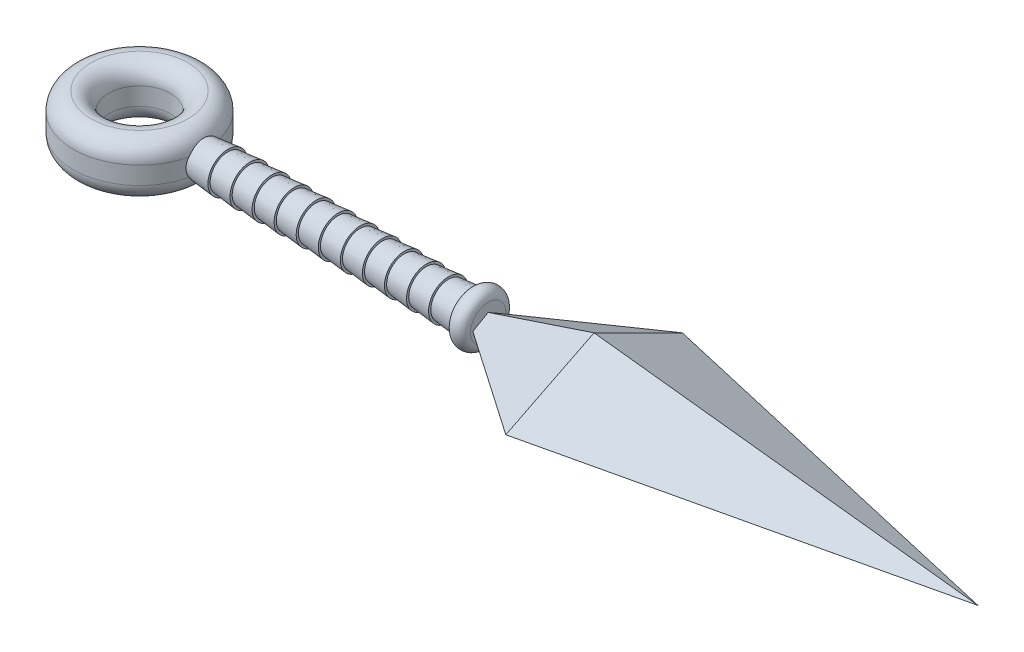
ISO-10303-21;
HEADER;
FILE_DESCRIPTION(('STEP AP214'),'2;1');
FILE_NAME('part.step','',(''),(''),'','','');
FILE_SCHEMA(('AUTOMOTIVE_DESIGN { 1 0 10303 214 1 1 1 1 }'));
ENDSEC;
DATA;
#1=APPLICATION_CONTEXT('core data for automotive mechanical design processes');
#2=APPLICATION_PROTOCOL_DEFINITION('international standard','automotive_design',2000,#1);
#3=PRODUCT_CONTEXT('',#1,'mechanical');
#4=PRODUCT('Part','Part','',(#3));
#5=PRODUCT_RELATED_PRODUCT_CATEGORY('part','',(#4));
#6=PRODUCT_DEFINITION_FORMATION('','',#4);
#7=PRODUCT_DEFINITION_CONTEXT('part definition',#1,'design');
#8=PRODUCT_DEFINITION('design','',#6,#7);
#9=PRODUCT_DEFINITION_SHAPE('','',#8);
#10=(LENGTH_UNIT() NAMED_UNIT(*) SI_UNIT(.MILLI.,.METRE.));
#11=(NAMED_UNIT(*) PLANE_ANGLE_UNIT() SI_UNIT($,.RADIAN.));
#12=(NAMED_UNIT(*) SI_UNIT($,.STERADIAN.) SOLID_ANGLE_UNIT());
#13=UNCERTAINTY_MEASURE_WITH_UNIT(LENGTH_MEASURE(1.E-05),#10,'distance_accuracy_value','');
#14=(GEOMETRIC_REPRESENTATION_CONTEXT(3) GLOBAL_UNCERTAINTY_ASSIGNED_CONTEXT((#13)) GLOBAL_UNIT_ASSIGNED_CONTEXT((#10,
#11,#12)) REPRESENTATION_CONTEXT('',''));
#15=CARTESIAN_POINT('',(0.,0.,0.));
#16=DIRECTION('',(0.,0.,1.));
#17=DIRECTION('',(1.,0.,0.));
#18=AXIS2_PLACEMENT_3D('',#15,#16,#17);
#19=CARTESIAN_POINT('',(75.,0.,0.));
#20=DIRECTION('',(-1.,0.,0.));
#21=DIRECTION('',(0.,0.,1.));
#22=AXIS2_PLACEMENT_3D('',#19,#20,#21);
#23=PLANE('',#22);
#24=CARTESIAN_POINT('',(75.,0.,0.));
#25=DIRECTION('',(-1.,0.,0.));
#26=DIRECTION('',(0.,0.,1.));
#27=AXIS2_PLACEMENT_3D('',#24,#25,#26);
#28=CIRCLE('',#27,4.5);
#29=CARTESIAN_POINT('',(75.,0.,4.5));
#30=VERTEX_POINT('',#29);
#31=EDGE_CURVE('E13',#30,#30,#28,.T.);
#32=ORIENTED_EDGE('',*,*,#31,.F.);
#33=EDGE_LOOP('',(#32));
#34=FACE_BOUND('',#33,.T.);
#35=ADVANCED_FACE('F73',(#34),#23,.F.);
#36=CARTESIAN_POINT('',(75.,0.,0.));
#37=DIRECTION('',(1.,0.,0.));
#38=DIRECTION('',(0.,0.,-1.));
#39=AXIS2_PLACEMENT_3D('',#36,#37,#38);
#40=CONICAL_SURFACE('',#39,4.5,0.0996686524911619);
#41=CARTESIAN_POINT('',(70.,0.,0.));
#42=DIRECTION('',(-1.,0.,0.));
#43=DIRECTION('',(0.,0.,1.));
#44=AXIS2_PLACEMENT_3D('',#41,#42,#43);
#45=CIRCLE('',#44,4.);
#46=CARTESIAN_POINT('',(70.,0.,4.));
#47=VERTEX_POINT('',#46);
#48=EDGE_CURVE('E80',#47,#47,#45,.T.);
#49=ORIENTED_EDGE('',*,*,#48,.F.);
#50=EDGE_LOOP('',(#49));
#51=FACE_BOUND('',#50,.T.);
#52=ORIENTED_EDGE('',*,*,#31,.T.);
#53=EDGE_LOOP('',(#52));
#54=FACE_BOUND('',#53,.T.);
#55=ADVANCED_FACE('F91',(#51,#54),#40,.T.);
#56=CARTESIAN_POINT('',(70.,4.,0.));
#57=DIRECTION('',(1.,0.,0.));
#58=DIRECTION('',(0.,0.,-1.));
#59=AXIS2_PLACEMENT_3D('',#56,#57,#58);
#60=PLANE('',#59);
#61=ORIENTED_EDGE('',*,*,#48,.T.);
#62=EDGE_LOOP('',(#61));
#63=FACE_BOUND('',#62,.T.);
#64=ADVANCED_FACE('F89',(#63),#60,.F.);
#65=CLOSED_SHELL('',(#35,#55,#64));
#66=MANIFOLD_SOLID_BREP('B2',#65);
#67=CARTESIAN_POINT('',(70.,0.,0.));
#68=DIRECTION('',(-1.,0.,0.));
#69=DIRECTION('',(0.,0.,1.));
#70=AXIS2_PLACEMENT_3D('',#67,#68,#69);
#71=PLANE('',#70);
#72=CARTESIAN_POINT('',(70.,0.,0.));
#73=DIRECTION('',(-1.,0.,0.));
#74=DIRECTION('',(0.,0.,1.));
#75=AXIS2_PLACEMENT_3D('',#72,#73,#74);
#76=CIRCLE('',#75,4.5);
#77=CARTESIAN_POINT('',(70.,0.,4.5));
#78=VERTEX_POINT('',#77);
#79=EDGE_CURVE('E72',#78,#78,#76,.T.);
#80=ORIENTED_EDGE('',*,*,#79,.F.);
#81=EDGE_LOOP('',(#80));
#82=FACE_BOUND('',#81,.T.);
#83=ADVANCED_FACE('F126',(#82),#71,.F.);
#84=CARTESIAN_POINT('',(70.,0.,0.));
#85=DIRECTION('',(1.,0.,0.));
#86=DIRECTION('',(0.,0.,-1.));
#87=AXIS2_PLACEMENT_3D('',#84,#85,#86);
#88=CONICAL_SURFACE('',#87,4.5,0.0996686524911619);
#89=CARTESIAN_POINT('',(65.,0.,0.));
#90=DIRECTION('',(-1.,0.,0.));
#91=DIRECTION('',(0.,0.,1.));
#92=AXIS2_PLACEMENT_3D('',#89,#90,#91);
#93=CIRCLE('',#92,4.);
#94=CARTESIAN_POINT('',(65.,0.,4.));
#95=VERTEX_POINT('',#94);
#96=EDGE_CURVE('E133',#95,#95,#93,.T.);
#97=ORIENTED_EDGE('',*,*,#96,.F.);
#98=EDGE_LOOP('',(#97));
#99=FACE_BOUND('',#98,.T.);
#100=ORIENTED_EDGE('',*,*,#79,.T.);
#101=EDGE_LOOP('',(#100));
#102=FACE_BOUND('',#101,.T.);
#103=ADVANCED_FACE('F144',(#99,#102),#88,.T.);
#104=CARTESIAN_POINT('',(65.,4.,0.));
#105=DIRECTION('',(1.,0.,0.));
#106=DIRECTION('',(0.,0.,-1.));
#107=AXIS2_PLACEMENT_3D('',#104,#105,#106);
#108=PLANE('',#107);
#109=ORIENTED_EDGE('',*,*,#96,.T.);
#110=EDGE_LOOP('',(#109));
#111=FACE_BOUND('',#110,.T.);
#112=ADVANCED_FACE('F142',(#111),#108,.F.);
#113=CLOSED_SHELL('',(#83,#103,#112));
#114=MANIFOLD_SOLID_BREP('B8',#113);
#115=CARTESIAN_POINT('',(65.,0.,0.));
#116=DIRECTION('',(-1.,0.,0.));
#117=DIRECTION('',(0.,0.,1.));
#118=AXIS2_PLACEMENT_3D('',#115,#116,#117);
#119=PLANE('',#118);
#120=CARTESIAN_POINT('',(65.,0.,0.));
#121=DIRECTION('',(-1.,0.,0.));
#122=DIRECTION('',(0.,0.,1.));
#123=AXIS2_PLACEMENT_3D('',#120,#121,#122);
#124=CIRCLE('',#123,4.5);
#125=CARTESIAN_POINT('',(65.,0.,4.5));
#126=VERTEX_POINT('',#125);
#127=EDGE_CURVE('E125',#126,#126,#124,.T.);
#128=ORIENTED_EDGE('',*,*,#127,.F.);
#129=EDGE_LOOP('',(#128));
#130=FACE_BOUND('',#129,.T.);
#131=ADVANCED_FACE('F179',(#130),#119,.F.);
#132=CARTESIAN_POINT('',(65.,0.,0.));
#133=DIRECTION('',(1.,0.,0.));
#134=DIRECTION('',(0.,0.,-1.));
#135=AXIS2_PLACEMENT_3D('',#132,#133,#134);
#136=CONICAL_SURFACE('',#135,4.5,0.0996686524911619);
#137=CARTESIAN_POINT('',(60.,0.,0.));
#138=DIRECTION('',(-1.,0.,0.));
#139=DIRECTION('',(0.,0.,1.));
#140=AXIS2_PLACEMENT_3D('',#137,#138,#139);
#141=CIRCLE('',#140,4.);
#142=CARTESIAN_POINT('',(60.,0.,4.));
#143=VERTEX_POINT('',#142);
#144=EDGE_CURVE('E186',#143,#143,#141,.T.);
#145=ORIENTED_EDGE('',*,*,#144,.F.);
#146=EDGE_LOOP('',(#145));
#147=FACE_BOUND('',#146,.T.);
#148=ORIENTED_EDGE('',*,*,#127,.T.);
#149=EDGE_LOOP('',(#148));
#150=FACE_BOUND('',#149,.T.);
#151=ADVANCED_FACE('F197',(#147,#150),#136,.T.);
#152=CARTESIAN_POINT('',(60.,4.,0.));
#153=DIRECTION('',(1.,0.,0.));
#154=DIRECTION('',(0.,0.,-1.));
#155=AXIS2_PLACEMENT_3D('',#152,#153,#154);
#156=PLANE('',#155);
#157=ORIENTED_EDGE('',*,*,#144,.T.);
#158=EDGE_LOOP('',(#157));
#159=FACE_BOUND('',#158,.T.);
#160=ADVANCED_FACE('F195',(#159),#156,.F.);
#161=CLOSED_SHELL('',(#131,#151,#160));
#162=MANIFOLD_SOLID_BREP('B67',#161);
#163=CARTESIAN_POINT('',(60.,0.,0.));
#164=DIRECTION('',(-1.,0.,0.));
#165=DIRECTION('',(0.,0.,1.));
#166=AXIS2_PLACEMENT_3D('',#163,#164,#165);
#167=PLANE('',#166);
#168=CARTESIAN_POINT('',(60.,0.,0.));
#169=DIRECTION('',(-1.,0.,0.));
#170=DIRECTION('',(0.,0.,1.));
#171=AXIS2_PLACEMENT_3D('',#168,#169,#170);
#172=CIRCLE('',#171,4.5);
#173=CARTESIAN_POINT('',(60.,0.,4.5));
#174=VERTEX_POINT('',#173);
#175=EDGE_CURVE('E178',#174,#174,#172,.T.);
#176=ORIENTED_EDGE('',*,*,#175,.F.);
#177=EDGE_LOOP('',(#176));
#178=FACE_BOUND('',#177,.T.);
#179=ADVANCED_FACE('F234',(#178),#167,.F.);
#180=CARTESIAN_POINT('',(60.,0.,0.));
#181=DIRECTION('',(1.,0.,0.));
#182=DIRECTION('',(0.,0.,-1.));
#183=AXIS2_PLACEMENT_3D('',#180,#181,#182);
#184=CONICAL_SURFACE('',#183,4.5,0.0996686524911619);
#185=CARTESIAN_POINT('',(55.,0.,0.));
#186=DIRECTION('',(-1.,0.,0.));
#187=DIRECTION('',(0.,0.,1.));
#188=AXIS2_PLACEMENT_3D('',#185,#186,#187);
#189=CIRCLE('',#188,4.);
#190=CARTESIAN_POINT('',(55.,0.,4.));
#191=VERTEX_POINT('',#190);
#192=EDGE_CURVE('E241',#191,#191,#189,.T.);
#193=ORIENTED_EDGE('',*,*,#192,.F.);
#194=EDGE_LOOP('',(#193));
#195=FACE_BOUND('',#194,.T.);
#196=ORIENTED_EDGE('',*,*,#175,.T.);
#197=EDGE_LOOP('',(#196));
#198=FACE_BOUND('',#197,.T.);
#199=ADVANCED_FACE('F252',(#195,#198),#184,.T.);
#200=CARTESIAN_POINT('',(55.,4.,0.));
#201=DIRECTION('',(1.,0.,0.));
#202=DIRECTION('',(0.,0.,-1.));
#203=AXIS2_PLACEMENT_3D('',#200,#201,#202);
#204=PLANE('',#203);
#205=ORIENTED_EDGE('',*,*,#192,.T.);
#206=EDGE_LOOP('',(#205));
#207=FACE_BOUND('',#206,.T.);
#208=ADVANCED_FACE('F250',(#207),#204,.F.);
#209=CLOSED_SHELL('',(#179,#199,#208));
#210=MANIFOLD_SOLID_BREP('B120',#209);
#211=CARTESIAN_POINT('',(55.,0.,0.));
#212=DIRECTION('',(-1.,0.,0.));
#213=DIRECTION('',(0.,0.,1.));
#214=AXIS2_PLACEMENT_3D('',#211,#212,#213);
#215=PLANE('',#214);
#216=CARTESIAN_POINT('',(55.,0.,0.));
#217=DIRECTION('',(-1.,0.,0.));
#218=DIRECTION('',(0.,0.,1.));
#219=AXIS2_PLACEMENT_3D('',#216,#217,#218);
#220=CIRCLE('',#219,4.5);
#221=CARTESIAN_POINT('',(55.,0.,4.5));
#222=VERTEX_POINT('',#221);
#223=EDGE_CURVE('E233',#222,#222,#220,.T.);
#224=ORIENTED_EDGE('',*,*,#223,.F.);
#225=EDGE_LOOP('',(#224));
#226=FACE_BOUND('',#225,.T.);
#227=ADVANCED_FACE('F295',(#226),#215,.F.);
#228=CARTESIAN_POINT('',(55.,0.,0.));
#229=DIRECTION('',(1.,0.,0.));
#230=DIRECTION('',(0.,0.,-1.));
#231=AXIS2_PLACEMENT_3D('',#228,#229,#230);
#232=CONICAL_SURFACE('',#231,4.5,0.0996686524911619);
#233=CARTESIAN_POINT('',(50.,0.,0.));
#234=DIRECTION('',(-1.,0.,0.));
#235=DIRECTION('',(0.,0.,1.));
#236=AXIS2_PLACEMENT_3D('',#233,#234,#235);
#237=CIRCLE('',#236,4.);
#238=CARTESIAN_POINT('',(50.,0.,4.));
#239=VERTEX_POINT('',#238);
#240=EDGE_CURVE('E302',#239,#239,#237,.T.);
#241=ORIENTED_EDGE('',*,*,#240,.F.);
#242=EDGE_LOOP('',(#241));
#243=FACE_BOUND('',#242,.T.);
#244=ORIENTED_EDGE('',*,*,#223,.T.);
#245=EDGE_LOOP('',(#244));
#246=FACE_BOUND('',#245,.T.);
#247=ADVANCED_FACE('F313',(#243,#246),#232,.T.);
#248=CARTESIAN_POINT('',(50.,4.,0.));
#249=DIRECTION('',(1.,0.,0.));
#250=DIRECTION('',(0.,0.,-1.));
#251=AXIS2_PLACEMENT_3D('',#248,#249,#250);
#252=PLANE('',#251);
#253=ORIENTED_EDGE('',*,*,#240,.T.);
#254=EDGE_LOOP('',(#253));
#255=FACE_BOUND('',#254,.T.);
#256=ADVANCED_FACE('F311',(#255),#252,.F.);
#257=CLOSED_SHELL('',(#227,#247,#256));
#258=MANIFOLD_SOLID_BREP('B173',#257);
#259=CARTESIAN_POINT('',(50.,0.,0.));
#260=DIRECTION('',(-1.,0.,0.));
#261=DIRECTION('',(0.,0.,1.));
#262=AXIS2_PLACEMENT_3D('',#259,#260,#261);
#263=PLANE('',#262);
#264=CARTESIAN_POINT('',(50.,0.,0.));
#265=DIRECTION('',(-1.,0.,0.));
#266=DIRECTION('',(0.,0.,1.));
#267=AXIS2_PLACEMENT_3D('',#264,#265,#266);
#268=CIRCLE('',#267,4.5);
#269=CARTESIAN_POINT('',(50.,0.,4.5));
#270=VERTEX_POINT('',#269);
#271=EDGE_CURVE('E294',#270,#270,#268,.T.);
#272=ORIENTED_EDGE('',*,*,#271,.F.);
#273=EDGE_LOOP('',(#272));
#274=FACE_BOUND('',#273,.T.);
#275=ADVANCED_FACE('F354',(#274),#263,.F.);
#276=CARTESIAN_POINT('',(50.,0.,0.));
#277=DIRECTION('',(1.,0.,0.));
#278=DIRECTION('',(0.,0.,-1.));
#279=AXIS2_PLACEMENT_3D('',#276,#277,#278);
#280=CONICAL_SURFACE('',#279,4.5,0.0996686524911619);
#281=CARTESIAN_POINT('',(45.,0.,0.));
#282=DIRECTION('',(-1.,0.,0.));
#283=DIRECTION('',(0.,0.,1.));
#284=AXIS2_PLACEMENT_3D('',#281,#282,#283);
#285=CIRCLE('',#284,4.);
#286=CARTESIAN_POINT('',(45.,0.,4.));
#287=VERTEX_POINT('',#286);
#288=EDGE_CURVE('E361',#287,#287,#285,.T.);
#289=ORIENTED_EDGE('',*,*,#288,.F.);
#290=EDGE_LOOP('',(#289));
#291=FACE_BOUND('',#290,.T.);
#292=ORIENTED_EDGE('',*,*,#271,.T.);
#293=EDGE_LOOP('',(#292));
#294=FACE_BOUND('',#293,.T.);
#295=ADVANCED_FACE('F372',(#291,#294),#280,.T.);
#296=CARTESIAN_POINT('',(45.,4.,0.));
#297=DIRECTION('',(1.,0.,0.));
#298=DIRECTION('',(0.,0.,-1.));
#299=AXIS2_PLACEMENT_3D('',#296,#297,#298);
#300=PLANE('',#299);
#301=ORIENTED_EDGE('',*,*,#288,.T.);
#302=EDGE_LOOP('',(#301));
#303=FACE_BOUND('',#302,.T.);
#304=ADVANCED_FACE('F370',(#303),#300,.F.);
#305=CLOSED_SHELL('',(#275,#295,#304));
#306=MANIFOLD_SOLID_BREP('B228',#305);
#307=CARTESIAN_POINT('',(45.,0.,0.));
#308=DIRECTION('',(-1.,0.,0.));
#309=DIRECTION('',(0.,0.,1.));
#310=AXIS2_PLACEMENT_3D('',#307,#308,#309);
#311=PLANE('',#310);
#312=CARTESIAN_POINT('',(45.,0.,0.));
#313=DIRECTION('',(-1.,0.,0.));
#314=DIRECTION('',(0.,0.,1.));
#315=AXIS2_PLACEMENT_3D('',#312,#313,#314);
#316=CIRCLE('',#315,4.5);
#317=CARTESIAN_POINT('',(45.,0.,4.5));
#318=VERTEX_POINT('',#317);
#319=EDGE_CURVE('E353',#318,#318,#316,.T.);
#320=ORIENTED_EDGE('',*,*,#319,.F.);
#321=EDGE_LOOP('',(#320));
#322=FACE_BOUND('',#321,.T.);
#323=ADVANCED_FACE('F407',(#322),#311,.F.);
#324=CARTESIAN_POINT('',(45.,0.,0.));
#325=DIRECTION('',(1.,0.,0.));
#326=DIRECTION('',(0.,0.,-1.));
#327=AXIS2_PLACEMENT_3D('',#324,#325,#326);
#328=CONICAL_SURFACE('',#327,4.5,0.0996686524911619);
#329=CARTESIAN_POINT('',(40.,0.,0.));
#330=DIRECTION('',(-1.,0.,0.));
#331=DIRECTION('',(0.,0.,1.));
#332=AXIS2_PLACEMENT_3D('',#329,#330,#331);
#333=CIRCLE('',#332,4.);
#334=CARTESIAN_POINT('',(40.,0.,4.));
#335=VERTEX_POINT('',#334);
#336=EDGE_CURVE('E414',#335,#335,#333,.T.);
#337=ORIENTED_EDGE('',*,*,#336,.F.);
#338=EDGE_LOOP('',(#337));
#339=FACE_BOUND('',#338,.T.);
#340=ORIENTED_EDGE('',*,*,#319,.T.);
#341=EDGE_LOOP('',(#340));
#342=FACE_BOUND('',#341,.T.);
#343=ADVANCED_FACE('F425',(#339,#342),#328,.T.);
#344=CARTESIAN_POINT('',(40.,4.,0.));
#345=DIRECTION('',(1.,0.,0.));
#346=DIRECTION('',(0.,0.,-1.));
#347=AXIS2_PLACEMENT_3D('',#344,#345,#346);
#348=PLANE('',#347);
#349=ORIENTED_EDGE('',*,*,#336,.T.);
#350=EDGE_LOOP('',(#349));
#351=FACE_BOUND('',#350,.T.);
#352=ADVANCED_FACE('F423',(#351),#348,.F.);
#353=CLOSED_SHELL('',(#323,#343,#352));
#354=MANIFOLD_SOLID_BREP('B289',#353);
#355=CARTESIAN_POINT('',(40.,0.,0.));
#356=DIRECTION('',(-1.,0.,0.));
#357=DIRECTION('',(0.,0.,1.));
#358=AXIS2_PLACEMENT_3D('',#355,#356,#357);
#359=PLANE('',#358);
#360=CARTESIAN_POINT('',(40.,0.,0.));
#361=DIRECTION('',(-1.,0.,0.));
#362=DIRECTION('',(0.,0.,1.));
#363=AXIS2_PLACEMENT_3D('',#360,#361,#362);
#364=CIRCLE('',#363,4.5);
#365=CARTESIAN_POINT('',(40.,0.,4.5));
#366=VERTEX_POINT('',#365);
#367=EDGE_CURVE('E406',#366,#366,#364,.T.);
#368=ORIENTED_EDGE('',*,*,#367,.F.);
#369=EDGE_LOOP('',(#368));
#370=FACE_BOUND('',#369,.T.);
#371=ADVANCED_FACE('F460',(#370),#359,.F.);
#372=CARTESIAN_POINT('',(40.,0.,0.));
#373=DIRECTION('',(1.,0.,0.));
#374=DIRECTION('',(0.,0.,-1.));
#375=AXIS2_PLACEMENT_3D('',#372,#373,#374);
#376=CONICAL_SURFACE('',#375,4.5,0.0996686524911619);
#377=CARTESIAN_POINT('',(35.,0.,0.));
#378=DIRECTION('',(-1.,0.,0.));
#379=DIRECTION('',(0.,0.,1.));
#380=AXIS2_PLACEMENT_3D('',#377,#378,#379);
#381=CIRCLE('',#380,4.);
#382=CARTESIAN_POINT('',(35.,0.,4.));
#383=VERTEX_POINT('',#382);
#384=EDGE_CURVE('E467',#383,#383,#381,.T.);
#385=ORIENTED_EDGE('',*,*,#384,.F.);
#386=EDGE_LOOP('',(#385));
#387=FACE_BOUND('',#386,.T.);
#388=ORIENTED_EDGE('',*,*,#367,.T.);
#389=EDGE_LOOP('',(#388));
#390=FACE_BOUND('',#389,.T.);
#391=ADVANCED_FACE('F478',(#387,#390),#376,.T.);
#392=CARTESIAN_POINT('',(35.,4.,0.));
#393=DIRECTION('',(1.,0.,0.));
#394=DIRECTION('',(0.,0.,-1.));
#395=AXIS2_PLACEMENT_3D('',#392,#393,#394);
#396=PLANE('',#395);
#397=ORIENTED_EDGE('',*,*,#384,.T.);
#398=EDGE_LOOP('',(#397));
#399=FACE_BOUND('',#398,.T.);
#400=ADVANCED_FACE('F476',(#399),#396,.F.);
#401=CLOSED_SHELL('',(#371,#391,#400));
#402=MANIFOLD_SOLID_BREP('B348',#401);
#403=CARTESIAN_POINT('',(35.,0.,0.));
#404=DIRECTION('',(-1.,0.,0.));
#405=DIRECTION('',(0.,0.,1.));
#406=AXIS2_PLACEMENT_3D('',#403,#404,#405);
#407=PLANE('',#406);
#408=CARTESIAN_POINT('',(35.,0.,0.));
#409=DIRECTION('',(-1.,0.,0.));
#410=DIRECTION('',(0.,0.,1.));
#411=AXIS2_PLACEMENT_3D('',#408,#409,#410);
#412=CIRCLE('',#411,4.5);
#413=CARTESIAN_POINT('',(35.,0.,4.5));
#414=VERTEX_POINT('',#413);
#415=EDGE_CURVE('E459',#414,#414,#412,.T.);
#416=ORIENTED_EDGE('',*,*,#415,.F.);
#417=EDGE_LOOP('',(#416));
#418=FACE_BOUND('',#417,.T.);
#419=ADVANCED_FACE('F515',(#418),#407,.F.);
#420=CARTESIAN_POINT('',(35.,0.,0.));
#421=DIRECTION('',(1.,0.,0.));
#422=DIRECTION('',(0.,0.,-1.));
#423=AXIS2_PLACEMENT_3D('',#420,#421,#422);
#424=CONICAL_SURFACE('',#423,4.5,0.0996686524911619);
#425=CARTESIAN_POINT('',(30.,0.,0.));
#426=DIRECTION('',(-1.,0.,0.));
#427=DIRECTION('',(0.,0.,1.));
#428=AXIS2_PLACEMENT_3D('',#425,#426,#427);
#429=CIRCLE('',#428,4.);
#430=CARTESIAN_POINT('',(30.,0.,4.));
#431=VERTEX_POINT('',#430);
#432=EDGE_CURVE('E522',#431,#431,#429,.T.);
#433=ORIENTED_EDGE('',*,*,#432,.F.);
#434=EDGE_LOOP('',(#433));
#435=FACE_BOUND('',#434,.T.);
#436=ORIENTED_EDGE('',*,*,#415,.T.);
#437=EDGE_LOOP('',(#436));
#438=FACE_BOUND('',#437,.T.);
#439=ADVANCED_FACE('F533',(#435,#438),#424,.T.);
#440=CARTESIAN_POINT('',(30.,4.,0.));
#441=DIRECTION('',(1.,0.,0.));
#442=DIRECTION('',(0.,0.,-1.));
#443=AXIS2_PLACEMENT_3D('',#440,#441,#442);
#444=PLANE('',#443);
#445=ORIENTED_EDGE('',*,*,#432,.T.);
#446=EDGE_LOOP('',(#445));
#447=FACE_BOUND('',#446,.T.);
#448=ADVANCED_FACE('F531',(#447),#444,.F.);
#449=CLOSED_SHELL('',(#419,#439,#448));
#450=MANIFOLD_SOLID_BREP('B401',#449);
#451=CARTESIAN_POINT('',(30.,0.,0.));
#452=DIRECTION('',(-1.,0.,0.));
#453=DIRECTION('',(0.,0.,1.));
#454=AXIS2_PLACEMENT_3D('',#451,#452,#453);
#455=PLANE('',#454);
#456=CARTESIAN_POINT('',(30.,0.,0.));
#457=DIRECTION('',(-1.,0.,0.));
#458=DIRECTION('',(0.,0.,1.));
#459=AXIS2_PLACEMENT_3D('',#456,#457,#458);
#460=CIRCLE('',#459,4.5);
#461=CARTESIAN_POINT('',(30.,0.,4.5));
#462=VERTEX_POINT('',#461);
#463=EDGE_CURVE('E514',#462,#462,#460,.T.);
#464=ORIENTED_EDGE('',*,*,#463,.F.);
#465=EDGE_LOOP('',(#464));
#466=FACE_BOUND('',#465,.T.);
#467=ADVANCED_FACE('F576',(#466),#455,.F.);
#468=CARTESIAN_POINT('',(30.,0.,0.));
#469=DIRECTION('',(1.,0.,0.));
#470=DIRECTION('',(0.,0.,-1.));
#471=AXIS2_PLACEMENT_3D('',#468,#469,#470);
#472=CONICAL_SURFACE('',#471,4.5,0.0996686524911619);
#473=CARTESIAN_POINT('',(25.,0.,0.));
#474=DIRECTION('',(-1.,0.,0.));
#475=DIRECTION('',(0.,0.,1.));
#476=AXIS2_PLACEMENT_3D('',#473,#474,#475);
#477=CIRCLE('',#476,4.);
#478=CARTESIAN_POINT('',(25.,0.,4.));
#479=VERTEX_POINT('',#478);
#480=EDGE_CURVE('E583',#479,#479,#477,.T.);
#481=ORIENTED_EDGE('',*,*,#480,.F.);
#482=EDGE_LOOP('',(#481));
#483=FACE_BOUND('',#482,.T.);
#484=ORIENTED_EDGE('',*,*,#463,.T.);
#485=EDGE_LOOP('',(#484));
#486=FACE_BOUND('',#485,.T.);
#487=ADVANCED_FACE('F594',(#483,#486),#472,.T.);
#488=CARTESIAN_POINT('',(25.,4.,0.));
#489=DIRECTION('',(1.,0.,0.));
#490=DIRECTION('',(0.,0.,-1.));
#491=AXIS2_PLACEMENT_3D('',#488,#489,#490);
#492=PLANE('',#491);
#493=ORIENTED_EDGE('',*,*,#480,.T.);
#494=EDGE_LOOP('',(#493));
#495=FACE_BOUND('',#494,.T.);
#496=ADVANCED_FACE('F592',(#495),#492,.F.);
#497=CLOSED_SHELL('',(#467,#487,#496));
#498=MANIFOLD_SOLID_BREP('B454',#497);
#499=CARTESIAN_POINT('',(25.,0.,0.));
#500=DIRECTION('',(-1.,0.,0.));
#501=DIRECTION('',(0.,0.,1.));
#502=AXIS2_PLACEMENT_3D('',#499,#500,#501);
#503=PLANE('',#502);
#504=CARTESIAN_POINT('',(25.,0.,0.));
#505=DIRECTION('',(-1.,0.,0.));
#506=DIRECTION('',(0.,0.,1.));
#507=AXIS2_PLACEMENT_3D('',#504,#505,#506);
#508=CIRCLE('',#507,4.5);
#509=CARTESIAN_POINT('',(25.,0.,4.5));
#510=VERTEX_POINT('',#509);
#511=EDGE_CURVE('E575',#510,#510,#508,.T.);
#512=ORIENTED_EDGE('',*,*,#511,.F.);
#513=EDGE_LOOP('',(#512));
#514=FACE_BOUND('',#513,.T.);
#515=ADVANCED_FACE('F635',(#514),#503,.F.);
#516=CARTESIAN_POINT('',(25.,0.,0.));
#517=DIRECTION('',(1.,0.,0.));
#518=DIRECTION('',(0.,0.,-1.));
#519=AXIS2_PLACEMENT_3D('',#516,#517,#518);
#520=CONICAL_SURFACE('',#519,4.5,0.0996686524911619);
#521=CARTESIAN_POINT('',(20.,0.,0.));
#522=DIRECTION('',(-1.,0.,0.));
#523=DIRECTION('',(0.,0.,1.));
#524=AXIS2_PLACEMENT_3D('',#521,#522,#523);
#525=CIRCLE('',#524,4.);
#526=CARTESIAN_POINT('',(20.,0.,4.));
#527=VERTEX_POINT('',#526);
#528=EDGE_CURVE('E642',#527,#527,#525,.T.);
#529=ORIENTED_EDGE('',*,*,#528,.F.);
#530=EDGE_LOOP('',(#529));
#531=FACE_BOUND('',#530,.T.);
#532=ORIENTED_EDGE('',*,*,#511,.T.);
#533=EDGE_LOOP('',(#532));
#534=FACE_BOUND('',#533,.T.);
#535=ADVANCED_FACE('F653',(#531,#534),#520,.T.);
#536=CARTESIAN_POINT('',(20.,4.,0.));
#537=DIRECTION('',(1.,0.,0.));
#538=DIRECTION('',(0.,0.,-1.));
#539=AXIS2_PLACEMENT_3D('',#536,#537,#538);
#540=PLANE('',#539);
#541=ORIENTED_EDGE('',*,*,#528,.T.);
#542=EDGE_LOOP('',(#541));
#543=FACE_BOUND('',#542,.T.);
#544=ADVANCED_FACE('F651',(#543),#540,.F.);
#545=CLOSED_SHELL('',(#515,#535,#544));
#546=MANIFOLD_SOLID_BREP('B509',#545);
#547=CARTESIAN_POINT('',(20.,0.,0.));
#548=DIRECTION('',(-1.,0.,0.));
#549=DIRECTION('',(0.,0.,1.));
#550=AXIS2_PLACEMENT_3D('',#547,#548,#549);
#551=PLANE('',#550);
#552=CARTESIAN_POINT('',(20.,0.,0.));
#553=DIRECTION('',(-1.,0.,0.));
#554=DIRECTION('',(0.,0.,1.));
#555=AXIS2_PLACEMENT_3D('',#552,#553,#554);
#556=CIRCLE('',#555,4.5);
#557=CARTESIAN_POINT('',(20.,0.,4.5));
#558=VERTEX_POINT('',#557);
#559=EDGE_CURVE('E634',#558,#558,#556,.T.);
#560=ORIENTED_EDGE('',*,*,#559,.F.);
#561=EDGE_LOOP('',(#560));
#562=FACE_BOUND('',#561,.T.);
#563=ADVANCED_FACE('F690',(#562),#551,.F.);
#564=CARTESIAN_POINT('',(20.,0.,0.));
#565=DIRECTION('',(1.,0.,0.));
#566=DIRECTION('',(0.,0.,-1.));
#567=AXIS2_PLACEMENT_3D('',#564,#565,#566);
#568=CONICAL_SURFACE('',#567,4.5,0.0996686524911619);
#569=CARTESIAN_POINT('',(13.,0.,0.));
#570=DIRECTION('',(1.,0.,0.));
#571=DIRECTION('',(0.,0.,-1.));
#572=AXIS2_PLACEMENT_3D('',#569,#570,#571);
#573=CIRCLE('',#572,3.8);
#574=CARTESIAN_POINT('',(13.,0.,-3.8));
#575=VERTEX_POINT('',#574);
#576=EDGE_CURVE('E694',#575,#575,#573,.F.);
#577=ORIENTED_EDGE('',*,*,#576,.F.);
#578=EDGE_LOOP('',(#577));
#579=FACE_BOUND('',#578,.T.);
#580=ORIENTED_EDGE('',*,*,#559,.T.);
#581=EDGE_LOOP('',(#580));
#582=FACE_BOUND('',#581,.T.);
#583=ADVANCED_FACE('F708',(#579,#582),#568,.T.);
#584=CARTESIAN_POINT('',(13.,4.,0.));
#585=DIRECTION('',(1.,0.,0.));
#586=DIRECTION('',(0.,0.,-1.));
#587=AXIS2_PLACEMENT_3D('',#584,#585,#586);
#588=PLANE('',#587);
#589=ORIENTED_EDGE('',*,*,#576,.T.);
#590=EDGE_LOOP('',(#589));
#591=FACE_BOUND('',#590,.T.);
#592=ADVANCED_FACE('F692',(#591),#588,.F.);
#593=CLOSED_SHELL('',(#563,#583,#592));
#594=MANIFOLD_SOLID_BREP('B570',#593);
#595=CARTESIAN_POINT('',(75.,0.,0.));
#596=DIRECTION('',(1.,0.,0.));
#597=DIRECTION('',(0.,0.,-1.));
#598=AXIS2_PLACEMENT_3D('',#595,#596,#597);
#599=PLANE('',#598);
#600=CARTESIAN_POINT('',(75.,0.,0.));
#601=DIRECTION('',(-1.,0.,0.));
#602=DIRECTION('',(0.,0.,1.));
#603=AXIS2_PLACEMENT_3D('',#600,#601,#602);
#604=CIRCLE('',#603,4.);
#605=CARTESIAN_POINT('',(75.,0.,4.));
#606=VERTEX_POINT('',#605);
#607=EDGE_CURVE('E688',#606,#606,#604,.T.);
#608=ORIENTED_EDGE('',*,*,#607,.T.);
#609=EDGE_LOOP('',(#608));
#610=FACE_BOUND('',#609,.T.);
#611=ADVANCED_FACE('F742',(#610),#599,.F.);
#612=CARTESIAN_POINT('',(77.,0.,0.));
#613=DIRECTION('',(-1.,0.,0.));
#614=DIRECTION('',(0.,0.,1.));
#615=AXIS2_PLACEMENT_3D('',#612,#613,#614);
#616=TOROIDAL_SURFACE('',#615,4.,2.);
#617=ORIENTED_EDGE('',*,*,#607,.F.);
#618=EDGE_LOOP('',(#617));
#619=FACE_BOUND('',#618,.T.);
#620=CARTESIAN_POINT('',(79.,0.,0.));
#621=DIRECTION('',(-1.,0.,0.));
#622=DIRECTION('',(0.,0.,1.));
#623=AXIS2_PLACEMENT_3D('',#620,#621,#622);
#624=CIRCLE('',#623,4.);
#625=CARTESIAN_POINT('',(79.,0.,4.));
#626=VERTEX_POINT('',#625);
#627=EDGE_CURVE('E751',#626,#626,#624,.T.);
#628=ORIENTED_EDGE('',*,*,#627,.T.);
#629=EDGE_LOOP('',(#628));
#630=FACE_BOUND('',#629,.T.);
#631=ADVANCED_FACE('F902',(#619,#630),#616,.T.);
#632=CARTESIAN_POINT('',(79.,4.,0.));
#633=DIRECTION('',(-1.,0.,0.));
#634=DIRECTION('',(0.,0.,1.));
#635=AXIS2_PLACEMENT_3D('',#632,#633,#634);
#636=PLANE('',#635);
#637=DIRECTION('',(0.,-0.5,0.866025403784439));
#638=VECTOR('',#637,1.);
#639=CARTESIAN_POINT('',(79.,2.,0.));
#640=LINE('',#639,#638);
#641=CARTESIAN_POINT('',(79.,2.,0.));
#642=VERTEX_POINT('',#641);
#643=CARTESIAN_POINT('',(79.,0.,3.46410161513775));
#644=VERTEX_POINT('',#643);
#645=EDGE_CURVE('E855',#642,#644,#640,.T.);
#646=ORIENTED_EDGE('',*,*,#645,.F.);
#647=DIRECTION('',(0.,0.5,0.866025403784439));
#648=VECTOR('',#647,1.);
#649=CARTESIAN_POINT('',(79.,0.,-3.46410161513775));
#650=LINE('',#649,#648);
#651=CARTESIAN_POINT('',(79.,0.,-3.46410161513775));
#652=VERTEX_POINT('',#651);
#653=EDGE_CURVE('E849',#652,#642,#650,.T.);
#654=ORIENTED_EDGE('',*,*,#653,.F.);
#655=DIRECTION('',(0.,0.5,-0.866025403784439));
#656=VECTOR('',#655,1.);
#657=CARTESIAN_POINT('',(79.,-2.,0.));
#658=LINE('',#657,#656);
#659=CARTESIAN_POINT('',(79.,-2.,0.));
#660=VERTEX_POINT('',#659);
#661=EDGE_CURVE('E794',#660,#652,#658,.T.);
#662=ORIENTED_EDGE('',*,*,#661,.F.);
#663=DIRECTION('',(0.,-0.5,-0.866025403784439));
#664=VECTOR('',#663,1.);
#665=CARTESIAN_POINT('',(79.,0.,3.46410161513775));
#666=LINE('',#665,#664);
#667=EDGE_CURVE('E881',#644,#660,#666,.T.);
#668=ORIENTED_EDGE('',*,*,#667,.F.);
#669=EDGE_LOOP('',(#646,#654,#662,#668));
#670=FACE_BOUND('',#669,.T.);
#671=ORIENTED_EDGE('',*,*,#627,.F.);
#672=EDGE_LOOP('',(#671));
#673=FACE_BOUND('',#672,.T.);
#674=ADVANCED_FACE('F899',(#670,#673),#636,.F.);
#675=CARTESIAN_POINT('',(79.,-2.,0.));
#676=CARTESIAN_POINT('',(103.,-10.,0.));
#677=CARTESIAN_POINT('',(79.,-1.66666666666666,-0.577350269189628));
#678=CARTESIAN_POINT('',(103.,-8.33333333333333,-3.33333333333334));
#679=CARTESIAN_POINT('',(79.,-1.33333333333333,-1.15470053837926));
#680=CARTESIAN_POINT('',(103.,-6.66666666666666,-6.66666666666668));
#681=CARTESIAN_POINT('',(79.,-0.666666666666664,-2.30940107675851));
#682=CARTESIAN_POINT('',(103.,-3.33333333333333,-13.3333333333333));
#683=CARTESIAN_POINT('',(79.,-0.333333333333332,-2.88675134594813));
#684=CARTESIAN_POINT('',(103.,-1.66666666666666,-16.6666666666667));
#685=CARTESIAN_POINT('',(79.,0.,-3.46410161513775));
#686=CARTESIAN_POINT('',(103.,0.,-20.));
#687=B_SPLINE_SURFACE_WITH_KNOTS('',3,1,((#675,#676),(#677,#678),(#679,#680),(#681,#682),(#683,
#684),(#685,#686)),.UNSPECIFIED.,.F.,.F.,.F.,(4,2,4),(2,2),(0.,0.5,1.),(0.,1.),.UNSPECIFIED.);
#688=DIRECTION('',(0.823466482437798,0.,-0.56736491987214));
#689=VECTOR('',#688,1.);
#690=CARTESIAN_POINT('',(91.,0.,-11.7320508075689));
#691=LINE('',#690,#689);
#692=CARTESIAN_POINT('',(103.,0.,-20.));
#693=VERTEX_POINT('',#692);
#694=EDGE_CURVE('E787',#652,#693,#691,.T.);
#695=DIRECTION('',(0.,0.447213595499958,-0.894427190999916));
#696=VECTOR('',#695,1.);
#697=CARTESIAN_POINT('',(103.,-10.,0.));
#698=LINE('',#697,#696);
#699=CARTESIAN_POINT('',(103.,-10.,0.));
#700=VERTEX_POINT('',#699);
#701=EDGE_CURVE('E791',#700,#693,#698,.T.);
#702=DIRECTION('',(-0.948683298050514,0.316227766016838,0.));
#703=VECTOR('',#702,1.);
#704=CARTESIAN_POINT('',(91.,-6.,0.));
#705=LINE('',#704,#703);
#706=EDGE_CURVE('E767',#700,#660,#705,.T.);
#707=ORIENTED_EDGE('',*,*,#661,.T.);
#708=ORIENTED_EDGE('',*,*,#694,.T.);
#709=ORIENTED_EDGE('',*,*,#701,.F.);
#710=ORIENTED_EDGE('',*,*,#706,.T.);
#711=EDGE_LOOP('',(#707,#708,#709,#710));
#712=FACE_BOUND('',#711,.T.);
#713=ADVANCED_FACE('F789',(#712),#687,.T.);
#714=CARTESIAN_POINT('',(79.,0.,-3.46410161513775));
#715=CARTESIAN_POINT('',(103.,0.,-20.));
#716=CARTESIAN_POINT('',(79.,0.333333333333334,-2.88675134594813));
#717=CARTESIAN_POINT('',(103.,1.66666666666667,-16.6666666666667));
#718=CARTESIAN_POINT('',(79.,0.666666666666668,-2.3094010767585));
#719=CARTESIAN_POINT('',(103.,3.33333333333334,-13.3333333333333));
#720=CARTESIAN_POINT('',(79.,1.33333333333333,-1.15470053837925));
#721=CARTESIAN_POINT('',(103.,6.66666666666667,-6.66666666666665));
#722=CARTESIAN_POINT('',(79.,1.66666666666667,-0.577350269189624));
#723=CARTESIAN_POINT('',(103.,8.33333333333334,-3.33333333333332));
#724=CARTESIAN_POINT('',(79.,2.,0.));
#725=CARTESIAN_POINT('',(103.,10.,0.));
#726=B_SPLINE_SURFACE_WITH_KNOTS('',3,1,((#714,#715),(#716,#717),(#718,#719),(#720,#721),(#722,
#723),(#724,#725)),.UNSPECIFIED.,.F.,.F.,.F.,(4,2,4),(2,2),(0.,0.5,1.),(0.,1.),.UNSPECIFIED.);
#727=DIRECTION('',(0.948683298050514,0.316227766016838,0.));
#728=VECTOR('',#727,1.);
#729=CARTESIAN_POINT('',(91.,6.,0.));
#730=LINE('',#729,#728);
#731=CARTESIAN_POINT('',(103.,10.,0.));
#732=VERTEX_POINT('',#731);
#733=EDGE_CURVE('E759',#642,#732,#730,.T.);
#734=DIRECTION('',(0.,0.447213595499958,0.894427190999916));
#735=VECTOR('',#734,1.);
#736=CARTESIAN_POINT('',(103.,0.,-20.));
#737=LINE('',#736,#735);
#738=EDGE_CURVE('E800',#693,#732,#737,.T.);
#739=ORIENTED_EDGE('',*,*,#653,.T.);
#740=ORIENTED_EDGE('',*,*,#733,.T.);
#741=ORIENTED_EDGE('',*,*,#738,.F.);
#742=ORIENTED_EDGE('',*,*,#694,.F.);
#743=EDGE_LOOP('',(#739,#740,#741,#742));
#744=FACE_BOUND('',#743,.T.);
#745=ADVANCED_FACE('F802',(#744),#726,.T.);
#746=CARTESIAN_POINT('',(79.,0.,3.46410161513775));
#747=CARTESIAN_POINT('',(103.,0.,20.));
#748=CARTESIAN_POINT('',(79.,-0.333333333333335,2.88675134594813));
#749=CARTESIAN_POINT('',(103.,-1.66666666666667,16.6666666666667));
#750=CARTESIAN_POINT('',(79.,-0.666666666666669,2.3094010767585));
#751=CARTESIAN_POINT('',(103.,-3.33333333333334,13.3333333333333));
#752=CARTESIAN_POINT('',(79.,-1.33333333333334,1.15470053837925));
#753=CARTESIAN_POINT('',(103.,-6.66666666666667,6.66666666666666));
#754=CARTESIAN_POINT('',(79.,-1.66666666666667,0.577350269189624));
#755=CARTESIAN_POINT('',(103.,-8.33333333333334,3.33333333333333));
#756=CARTESIAN_POINT('',(79.,-2.,0.));
#757=CARTESIAN_POINT('',(103.,-10.,0.));
#758=B_SPLINE_SURFACE_WITH_KNOTS('',3,1,((#746,#747),(#748,#749),(#750,#751),(#752,#753),(#754,
#755),(#756,#757)),.UNSPECIFIED.,.F.,.F.,.F.,(4,2,4),(2,2),(0.,0.5,1.),(0.,1.),.UNSPECIFIED.);
#759=DIRECTION('',(0.,-0.447213595499958,-0.894427190999916));
#760=VECTOR('',#759,1.);
#761=CARTESIAN_POINT('',(103.,0.,20.));
#762=LINE('',#761,#760);
#763=CARTESIAN_POINT('',(103.,0.,20.));
#764=VERTEX_POINT('',#763);
#765=EDGE_CURVE('E822',#764,#700,#762,.T.);
#766=DIRECTION('',(0.823466482437798,0.,0.56736491987214));
#767=VECTOR('',#766,1.);
#768=CARTESIAN_POINT('',(91.,0.,11.7320508075689));
#769=LINE('',#768,#767);
#770=EDGE_CURVE('E808',#644,#764,#769,.T.);
#771=ORIENTED_EDGE('',*,*,#667,.T.);
#772=ORIENTED_EDGE('',*,*,#706,.F.);
#773=ORIENTED_EDGE('',*,*,#765,.F.);
#774=ORIENTED_EDGE('',*,*,#770,.F.);
#775=EDGE_LOOP('',(#771,#772,#773,#774));
#776=FACE_BOUND('',#775,.T.);
#777=ADVANCED_FACE('F898',(#776),#758,.T.);
#778=CARTESIAN_POINT('',(79.,2.,0.));
#779=CARTESIAN_POINT('',(103.,10.,0.));
#780=CARTESIAN_POINT('',(79.,1.66666666666667,0.577350269189626));
#781=CARTESIAN_POINT('',(103.,8.33333333333333,3.33333333333335));
#782=CARTESIAN_POINT('',(79.,1.33333333333333,1.15470053837925));
#783=CARTESIAN_POINT('',(103.,6.66666666666665,6.66666666666669));
#784=CARTESIAN_POINT('',(79.,0.666666666666667,2.3094010767585));
#785=CARTESIAN_POINT('',(103.,3.33333333333332,13.3333333333334));
#786=CARTESIAN_POINT('',(79.,0.333333333333333,2.88675134594813));
#787=CARTESIAN_POINT('',(103.,1.66666666666666,16.6666666666667));
#788=CARTESIAN_POINT('',(79.,0.,3.46410161513776));
#789=CARTESIAN_POINT('',(103.,0.,20.));
#790=B_SPLINE_SURFACE_WITH_KNOTS('',3,1,((#778,#779),(#780,#781),(#782,#783),(#784,#785),(#786,
#787),(#788,#789)),.UNSPECIFIED.,.F.,.F.,.F.,(4,2,4),(2,2),(0.,0.5,1.),(0.,1.),.UNSPECIFIED.);
#791=DIRECTION('',(0.,-0.447213595499958,0.894427190999916));
#792=VECTOR('',#791,1.);
#793=CARTESIAN_POINT('',(103.,10.,0.));
#794=LINE('',#793,#792);
#795=EDGE_CURVE('E807',#732,#764,#794,.T.);
#796=ORIENTED_EDGE('',*,*,#645,.T.);
#797=ORIENTED_EDGE('',*,*,#770,.T.);
#798=ORIENTED_EDGE('',*,*,#795,.F.);
#799=ORIENTED_EDGE('',*,*,#733,.F.);
#800=EDGE_LOOP('',(#796,#797,#798,#799));
#801=FACE_BOUND('',#800,.T.);
#802=ADVANCED_FACE('F895',(#801),#790,.T.);
#803=CARTESIAN_POINT('',(1.98718786769512,-17.2885344489476,-8.64426722447379));
#804=DIRECTION('',(-0.10226868295908,0.889737541743998,0.444868770871999));
#805=DIRECTION('',(0.,-0.447213595499958,0.894427190999916));
#806=AXIS2_PLACEMENT_3D('',#803,#804,#805);
#807=PLANE('',#806);
#808=DIRECTION('',(0.974579651079457,0.,0.224041299098726));
#809=VECTOR('',#808,1.);
#810=CARTESIAN_POINT('',(103.,0.,-20.));
#811=LINE('',#810,#809);
#812=CARTESIAN_POINT('',(190.,0.,0.));
#813=VERTEX_POINT('',#812);
#814=EDGE_CURVE('E811',#693,#813,#811,.T.);
#815=ORIENTED_EDGE('',*,*,#814,.T.);
#816=DIRECTION('',(0.993458851833112,0.114190672624496,0.));
#817=VECTOR('',#816,1.);
#818=CARTESIAN_POINT('',(103.,-10.,0.));
#819=LINE('',#818,#817);
#820=EDGE_CURVE('E818',#700,#813,#819,.T.);
#821=ORIENTED_EDGE('',*,*,#820,.F.);
#822=ORIENTED_EDGE('',*,*,#701,.T.);
#823=EDGE_LOOP('',(#815,#821,#822));
#824=FACE_BOUND('',#823,.T.);
#825=ADVANCED_FACE('F820',(#824),#807,.F.);
#826=CARTESIAN_POINT('',(1.98718786769512,-17.2885344489476,8.64426722447379));
#827=DIRECTION('',(-0.10226868295908,0.889737541743998,-0.444868770871999));
#828=DIRECTION('',(0.,0.447213595499958,0.894427190999916));
#829=AXIS2_PLACEMENT_3D('',#826,#827,#828);
#830=PLANE('',#829);
#831=ORIENTED_EDGE('',*,*,#820,.T.);
#832=DIRECTION('',(0.974579651079457,0.,-0.224041299098726));
#833=VECTOR('',#832,1.);
#834=CARTESIAN_POINT('',(103.,0.,20.));
#835=LINE('',#834,#833);
#836=EDGE_CURVE('E844',#764,#813,#835,.T.);
#837=ORIENTED_EDGE('',*,*,#836,.F.);
#838=ORIENTED_EDGE('',*,*,#765,.T.);
#839=EDGE_LOOP('',(#831,#837,#838));
#840=FACE_BOUND('',#839,.T.);
#841=ADVANCED_FACE('F847',(#840),#830,.F.);
#842=CARTESIAN_POINT('',(1.98718786769512,17.2885344489476,-8.64426722447379));
#843=DIRECTION('',(-0.10226868295908,-0.889737541743998,0.444868770871999));
#844=DIRECTION('',(0.,-0.447213595499958,-0.894427190999916));
#845=AXIS2_PLACEMENT_3D('',#842,#843,#844);
#846=PLANE('',#845);
#847=DIRECTION('',(0.993458851833112,-0.114190672624496,0.));
#848=VECTOR('',#847,1.);
#849=CARTESIAN_POINT('',(103.,10.,0.));
#850=LINE('',#849,#848);
#851=EDGE_CURVE('E813',#732,#813,#850,.T.);
#852=ORIENTED_EDGE('',*,*,#851,.T.);
#853=ORIENTED_EDGE('',*,*,#814,.F.);
#854=ORIENTED_EDGE('',*,*,#738,.T.);
#855=EDGE_LOOP('',(#852,#853,#854));
#856=FACE_BOUND('',#855,.T.);
#857=ADVANCED_FACE('F812',(#856),#846,.F.);
#858=CARTESIAN_POINT('',(1.98718786769512,17.2885344489476,8.64426722447379));
#859=DIRECTION('',(-0.10226868295908,-0.889737541743998,-0.444868770871999));
#860=DIRECTION('',(0.,0.447213595499958,-0.894427190999916));
#861=AXIS2_PLACEMENT_3D('',#858,#859,#860);
#862=PLANE('',#861);
#863=ORIENTED_EDGE('',*,*,#836,.T.);
#864=ORIENTED_EDGE('',*,*,#851,.F.);
#865=ORIENTED_EDGE('',*,*,#795,.T.);
#866=EDGE_LOOP('',(#863,#864,#865));
#867=FACE_BOUND('',#866,.T.);
#868=ADVANCED_FACE('F843',(#867),#862,.F.);
#869=CLOSED_SHELL('',(#611,#631,#674,#713,#745,#777,#802,#825,#841,#857,#868));
#870=MANIFOLD_SOLID_BREP('B629',#869);
#871=CARTESIAN_POINT('',(0.,6.,0.));
#872=DIRECTION('',(0.,-1.,0.));
#873=DIRECTION('',(0.,0.,-1.));
#874=AXIS2_PLACEMENT_3D('',#871,#872,#873);
#875=CYLINDRICAL_SURFACE('',#874,15.);
#876=CARTESIAN_POINT('',(0.,-2.,0.));
#877=DIRECTION('',(0.,1.,0.));
#878=DIRECTION('',(0.,0.,1.));
#879=AXIS2_PLACEMENT_3D('',#876,#877,#878);
#880=CIRCLE('',#879,15.);
#881=CARTESIAN_POINT('',(0.,-2.,15.));
#882=VERTEX_POINT('',#881);
#883=EDGE_CURVE('E741',#882,#882,#880,.T.);
#884=ORIENTED_EDGE('',*,*,#883,.T.);
#885=EDGE_LOOP('',(#884));
#886=FACE_BOUND('',#885,.T.);
#887=CARTESIAN_POINT('',(0.,2.,0.));
#888=DIRECTION('',(0.,1.,0.));
#889=DIRECTION('',(0.,0.,1.));
#890=AXIS2_PLACEMENT_3D('',#887,#888,#889);
#891=CIRCLE('',#890,15.);
#892=CARTESIAN_POINT('',(0.,2.,15.));
#893=VERTEX_POINT('',#892);
#894=EDGE_CURVE('E1067',#893,#893,#891,.F.);
#895=ORIENTED_EDGE('',*,*,#894,.T.);
#896=EDGE_LOOP('',(#895));
#897=FACE_BOUND('',#896,.T.);
#898=ADVANCED_FACE('F1058',(#886,#897),#875,.T.);
#899=CARTESIAN_POINT('',(0.,6.,0.));
#900=DIRECTION('',(0.,-1.,0.));
#901=DIRECTION('',(0.,0.,-1.));
#902=AXIS2_PLACEMENT_3D('',#899,#900,#901);
#903=CYLINDRICAL_SURFACE('',#902,7.);
#904=CARTESIAN_POINT('',(0.,-2.,0.));
#905=DIRECTION('',(0.,1.,0.));
#906=DIRECTION('',(0.,0.,1.));
#907=AXIS2_PLACEMENT_3D('',#904,#905,#906);
#908=CIRCLE('',#907,7.);
#909=CARTESIAN_POINT('',(0.,-2.,7.));
#910=VERTEX_POINT('',#909);
#911=EDGE_CURVE('E1074',#910,#910,#908,.F.);
#912=ORIENTED_EDGE('',*,*,#911,.T.);
#913=EDGE_LOOP('',(#912));
#914=FACE_BOUND('',#913,.T.);
#915=CARTESIAN_POINT('',(0.,2.,0.));
#916=DIRECTION('',(0.,1.,0.));
#917=DIRECTION('',(0.,0.,1.));
#918=AXIS2_PLACEMENT_3D('',#915,#916,#917);
#919=CIRCLE('',#918,7.);
#920=CARTESIAN_POINT('',(0.,2.,7.));
#921=VERTEX_POINT('',#920);
#922=EDGE_CURVE('E1080',#921,#921,#919,.T.);
#923=ORIENTED_EDGE('',*,*,#922,.T.);
#924=EDGE_LOOP('',(#923));
#925=FACE_BOUND('',#924,.T.);
#926=ADVANCED_FACE('F1107',(#914,#925),#903,.F.);
#927=CARTESIAN_POINT('',(0.,-2.,0.));
#928=DIRECTION('',(0.,1.,0.));
#929=DIRECTION('',(0.,0.,1.));
#930=AXIS2_PLACEMENT_3D('',#927,#928,#929);
#931=TOROIDAL_SURFACE('',#930,11.,4.);
#932=ORIENTED_EDGE('',*,*,#883,.F.);
#933=EDGE_LOOP('',(#932));
#934=FACE_BOUND('',#933,.T.);
#935=CARTESIAN_POINT('',(0.,-6.,0.));
#936=DIRECTION('',(0.,1.,0.));
#937=DIRECTION('',(0.,0.,1.));
#938=AXIS2_PLACEMENT_3D('',#935,#936,#937);
#939=CIRCLE('',#938,11.);
#940=CARTESIAN_POINT('',(0.,-6.,11.));
#941=VERTEX_POINT('',#940);
#942=EDGE_CURVE('E1077',#941,#941,#939,.F.);
#943=ORIENTED_EDGE('',*,*,#942,.F.);
#944=EDGE_LOOP('',(#943));
#945=FACE_BOUND('',#944,.T.);
#946=ADVANCED_FACE('F1102',(#934,#945),#931,.T.);
#947=CARTESIAN_POINT('',(0.,-2.,0.));
#948=DIRECTION('',(0.,1.,0.));
#949=DIRECTION('',(0.,0.,1.));
#950=AXIS2_PLACEMENT_3D('',#947,#948,#949);
#951=TOROIDAL_SURFACE('',#950,11.,4.);
#952=ORIENTED_EDGE('',*,*,#911,.F.);
#953=EDGE_LOOP('',(#952));
#954=FACE_BOUND('',#953,.T.);
#955=ORIENTED_EDGE('',*,*,#942,.T.);
#956=EDGE_LOOP('',(#955));
#957=FACE_BOUND('',#956,.T.);
#958=ADVANCED_FACE('F1096',(#954,#957),#951,.T.);
#959=CARTESIAN_POINT('',(0.,2.,0.));
#960=DIRECTION('',(0.,1.,0.));
#961=DIRECTION('',(0.,0.,1.));
#962=AXIS2_PLACEMENT_3D('',#959,#960,#961);
#963=TOROIDAL_SURFACE('',#962,11.,4.);
#964=ORIENTED_EDGE('',*,*,#894,.F.);
#965=EDGE_LOOP('',(#964));
#966=FACE_BOUND('',#965,.T.);
#967=CARTESIAN_POINT('',(0.,6.,0.));
#968=DIRECTION('',(0.,1.,0.));
#969=DIRECTION('',(0.,0.,1.));
#970=AXIS2_PLACEMENT_3D('',#967,#968,#969);
#971=CIRCLE('',#970,11.);
#972=CARTESIAN_POINT('',(0.,6.,11.));
#973=VERTEX_POINT('',#972);
#974=EDGE_CURVE('E1062',#973,#973,#971,.T.);
#975=ORIENTED_EDGE('',*,*,#974,.F.);
#976=EDGE_LOOP('',(#975));
#977=FACE_BOUND('',#976,.T.);
#978=ADVANCED_FACE('F1060',(#966,#977),#963,.T.);
#979=CARTESIAN_POINT('',(0.,2.,0.));
#980=DIRECTION('',(0.,1.,0.));
#981=DIRECTION('',(0.,0.,1.));
#982=AXIS2_PLACEMENT_3D('',#979,#980,#981);
#983=TOROIDAL_SURFACE('',#982,11.,4.);
#984=ORIENTED_EDGE('',*,*,#974,.T.);
#985=EDGE_LOOP('',(#984));
#986=FACE_BOUND('',#985,.T.);
#987=ORIENTED_EDGE('',*,*,#922,.F.);
#988=EDGE_LOOP('',(#987));
#989=FACE_BOUND('',#988,.T.);
#990=ADVANCED_FACE('F1092',(#986,#989),#983,.T.);
#991=CLOSED_SHELL('',(#898,#926,#946,#958,#978,#990));
#992=MANIFOLD_SOLID_BREP('B682',#991);
#993=ADVANCED_BREP_SHAPE_REPRESENTATION('',(#18,#66,#114,#162,#210,#258,#306,#354,#402,#450,
#498,#546,#594,#870,#992),#14);
#994=SHAPE_DEFINITION_REPRESENTATION(#9,#993);
ENDSEC;
END-ISO-10303-21;
